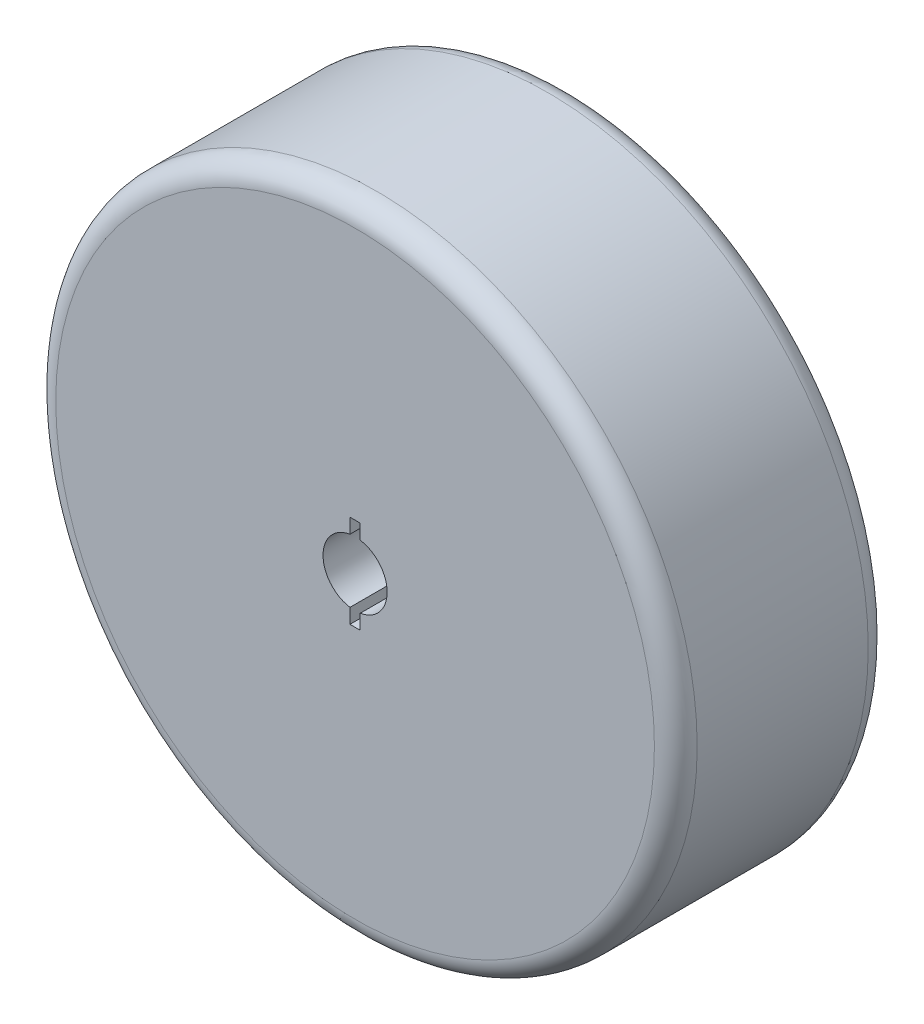
ISO-10303-21;
HEADER;
FILE_DESCRIPTION(('STEP AP214'),'2;1');
FILE_NAME('part.step','',(''),(''),'','','');
FILE_SCHEMA(('AUTOMOTIVE_DESIGN { 1 0 10303 214 1 1 1 1 }'));
ENDSEC;
DATA;
#1=APPLICATION_CONTEXT('core data for automotive mechanical design processes');
#2=APPLICATION_PROTOCOL_DEFINITION('international standard','automotive_design',2000,#1);
#3=PRODUCT_CONTEXT('',#1,'mechanical');
#4=PRODUCT('Part','Part','',(#3));
#5=PRODUCT_RELATED_PRODUCT_CATEGORY('part','',(#4));
#6=PRODUCT_DEFINITION_FORMATION('','',#4);
#7=PRODUCT_DEFINITION_CONTEXT('part definition',#1,'design');
#8=PRODUCT_DEFINITION('design','',#6,#7);
#9=PRODUCT_DEFINITION_SHAPE('','',#8);
#10=(LENGTH_UNIT() NAMED_UNIT(*) SI_UNIT(.MILLI.,.METRE.));
#11=(NAMED_UNIT(*) PLANE_ANGLE_UNIT() SI_UNIT($,.RADIAN.));
#12=(NAMED_UNIT(*) SI_UNIT($,.STERADIAN.) SOLID_ANGLE_UNIT());
#13=UNCERTAINTY_MEASURE_WITH_UNIT(LENGTH_MEASURE(1.E-05),#10,'distance_accuracy_value','');
#14=(GEOMETRIC_REPRESENTATION_CONTEXT(3) GLOBAL_UNCERTAINTY_ASSIGNED_CONTEXT((#13)) GLOBAL_UNIT_ASSIGNED_CONTEXT((#10,
#11,#12)) REPRESENTATION_CONTEXT('',''));
#15=CARTESIAN_POINT('',(0.,0.,0.));
#16=DIRECTION('',(0.,0.,1.));
#17=DIRECTION('',(1.,0.,0.));
#18=AXIS2_PLACEMENT_3D('',#15,#16,#17);
#19=CARTESIAN_POINT('',(0.,0.,-0.001000000000001));
#20=DIRECTION('',(0.,0.,1.));
#21=DIRECTION('',(1.,0.,0.));
#22=AXIS2_PLACEMENT_3D('',#19,#20,#21);
#23=CYLINDRICAL_SURFACE('',#22,3.81);
#24=CARTESIAN_POINT('',(0.,0.,25.4));
#25=DIRECTION('',(0.,0.,1.));
#26=DIRECTION('',(1.,0.,0.));
#27=AXIS2_PLACEMENT_3D('',#24,#25,#26);
#28=CIRCLE('',#27,3.81);
#29=CARTESIAN_POINT('',(0.610207571696719,-3.76081729407904,25.4));
#30=VERTEX_POINT('',#29);
#31=CARTESIAN_POINT('',(0.610207571696719,3.76081729407904,25.4));
#32=VERTEX_POINT('',#31);
#33=EDGE_CURVE('E117',#30,#32,#28,.T.);
#34=ORIENTED_EDGE('',*,*,#33,.T.);
#35=DIRECTION('',(0.,0.,1.));
#36=VECTOR('',#35,1.);
#37=CARTESIAN_POINT('',(0.610207571696719,3.76081729407904,-0.001000000000001));
#38=LINE('',#37,#36);
#39=CARTESIAN_POINT('',(0.610207571696719,3.76081729407904,0.));
#40=VERTEX_POINT('',#39);
#41=EDGE_CURVE('E99',#40,#32,#38,.T.);
#42=ORIENTED_EDGE('',*,*,#41,.F.);
#43=CARTESIAN_POINT('',(0.,0.,0.));
#44=DIRECTION('',(0.,0.,1.));
#45=DIRECTION('',(1.,0.,0.));
#46=AXIS2_PLACEMENT_3D('',#43,#44,#45);
#47=CIRCLE('',#46,3.81);
#48=CARTESIAN_POINT('',(0.610207571696719,-3.76081729407904,0.));
#49=VERTEX_POINT('',#48);
#50=EDGE_CURVE('E121',#40,#49,#47,.F.);
#51=ORIENTED_EDGE('',*,*,#50,.T.);
#52=DIRECTION('',(0.,0.,1.));
#53=VECTOR('',#52,1.);
#54=CARTESIAN_POINT('',(0.610207571696719,-3.76081729407904,-0.001000000000001));
#55=LINE('',#54,#53);
#56=EDGE_CURVE('E120',#30,#49,#55,.F.);
#57=ORIENTED_EDGE('',*,*,#56,.F.);
#58=EDGE_LOOP('',(#34,#42,#51,#57));
#59=FACE_BOUND('',#58,.T.);
#60=ADVANCED_FACE('F33',(#59),#23,.F.);
#61=CARTESIAN_POINT('',(0.,0.,25.4));
#62=DIRECTION('',(0.,0.,-1.));
#63=DIRECTION('',(-1.,0.,0.));
#64=AXIS2_PLACEMENT_3D('',#61,#62,#63);
#65=CYLINDRICAL_SURFACE('',#64,38.1);
#66=CARTESIAN_POINT('',(0.,0.,2.54));
#67=DIRECTION('',(0.,0.,1.));
#68=DIRECTION('',(1.,0.,0.));
#69=AXIS2_PLACEMENT_3D('',#66,#67,#68);
#70=CIRCLE('',#69,38.1);
#71=CARTESIAN_POINT('',(38.1,0.,2.54));
#72=VERTEX_POINT('',#71);
#73=EDGE_CURVE('E41',#72,#72,#70,.T.);
#74=ORIENTED_EDGE('',*,*,#73,.T.);
#75=EDGE_LOOP('',(#74));
#76=FACE_BOUND('',#75,.T.);
#77=CARTESIAN_POINT('',(0.,0.,22.86));
#78=DIRECTION('',(0.,0.,1.));
#79=DIRECTION('',(1.,0.,0.));
#80=AXIS2_PLACEMENT_3D('',#77,#78,#79);
#81=CIRCLE('',#80,38.1);
#82=CARTESIAN_POINT('',(38.1,0.,22.86));
#83=VERTEX_POINT('',#82);
#84=EDGE_CURVE('E135',#83,#83,#81,.F.);
#85=ORIENTED_EDGE('',*,*,#84,.T.);
#86=EDGE_LOOP('',(#85));
#87=FACE_BOUND('',#86,.T.);
#88=ADVANCED_FACE('F140',(#76,#87),#65,.T.);
#89=CARTESIAN_POINT('',(0.,0.,25.4));
#90=DIRECTION('',(0.,0.,1.));
#91=DIRECTION('',(1.,0.,0.));
#92=AXIS2_PLACEMENT_3D('',#89,#90,#91);
#93=PLANE('',#92);
#94=DIRECTION('',(0.,1.,0.));
#95=VECTOR('',#94,1.);
#96=CARTESIAN_POINT('',(0.610207571696719,-5.51132643214203,25.4));
#97=LINE('',#96,#95);
#98=CARTESIAN_POINT('',(0.610207571696719,5.51132643214203,25.4));
#99=VERTEX_POINT('',#98);
#100=EDGE_CURVE('E103',#32,#99,#97,.T.);
#101=ORIENTED_EDGE('',*,*,#100,.F.);
#102=ORIENTED_EDGE('',*,*,#33,.F.);
#103=DIRECTION('',(0.,1.,0.));
#104=VECTOR('',#103,1.);
#105=CARTESIAN_POINT('',(0.610207571696719,-5.51132643214203,25.4));
#106=LINE('',#105,#104);
#107=CARTESIAN_POINT('',(0.610207571696719,-5.51132643214203,25.4));
#108=VERTEX_POINT('',#107);
#109=EDGE_CURVE('E56',#108,#30,#106,.T.);
#110=ORIENTED_EDGE('',*,*,#109,.F.);
#111=DIRECTION('',(1.,0.,0.));
#112=VECTOR('',#111,1.);
#113=CARTESIAN_POINT('',(-0.610207571696719,-5.51132643214203,25.4));
#114=LINE('',#113,#112);
#115=CARTESIAN_POINT('',(-0.610207571696719,-5.51132643214203,25.4));
#116=VERTEX_POINT('',#115);
#117=EDGE_CURVE('E201',#116,#108,#114,.T.);
#118=ORIENTED_EDGE('',*,*,#117,.F.);
#119=DIRECTION('',(0.,-1.,0.));
#120=VECTOR('',#119,1.);
#121=CARTESIAN_POINT('',(-0.610207571696719,-5.51132643214203,25.4));
#122=LINE('',#121,#120);
#123=CARTESIAN_POINT('',(-0.610207571696719,-3.76081729407904,25.4));
#124=VERTEX_POINT('',#123);
#125=EDGE_CURVE('E198',#124,#116,#122,.T.);
#126=ORIENTED_EDGE('',*,*,#125,.F.);
#127=CARTESIAN_POINT('',(-0.610207571696719,3.76081729407904,25.4));
#128=VERTEX_POINT('',#127);
#129=EDGE_CURVE('E122',#128,#124,#28,.T.);
#130=ORIENTED_EDGE('',*,*,#129,.F.);
#131=DIRECTION('',(0.,-1.,0.));
#132=VECTOR('',#131,1.);
#133=CARTESIAN_POINT('',(-0.610207571696719,-5.51132643214203,25.4));
#134=LINE('',#133,#132);
#135=CARTESIAN_POINT('',(-0.610207571696719,5.51132643214203,25.4));
#136=VERTEX_POINT('',#135);
#137=EDGE_CURVE('E48',#136,#128,#134,.T.);
#138=ORIENTED_EDGE('',*,*,#137,.F.);
#139=DIRECTION('',(-1.,0.,0.));
#140=VECTOR('',#139,1.);
#141=CARTESIAN_POINT('',(-0.610207571696719,5.51132643214203,25.4));
#142=LINE('',#141,#140);
#143=EDGE_CURVE('E111',#99,#136,#142,.T.);
#144=ORIENTED_EDGE('',*,*,#143,.F.);
#145=EDGE_LOOP('',(#101,#102,#110,#118,#126,#130,#138,#144));
#146=FACE_BOUND('',#145,.T.);
#147=CARTESIAN_POINT('',(0.,0.,25.4));
#148=DIRECTION('',(0.,0.,1.));
#149=DIRECTION('',(1.,0.,0.));
#150=AXIS2_PLACEMENT_3D('',#147,#148,#149);
#151=CIRCLE('',#150,35.56);
#152=CARTESIAN_POINT('',(35.56,0.,25.4));
#153=VERTEX_POINT('',#152);
#154=EDGE_CURVE('E132',#153,#153,#151,.T.);
#155=ORIENTED_EDGE('',*,*,#154,.T.);
#156=EDGE_LOOP('',(#155));
#157=FACE_BOUND('',#156,.T.);
#158=ADVANCED_FACE('F115',(#146,#157),#93,.T.);
#159=CARTESIAN_POINT('',(0.,0.,0.));
#160=DIRECTION('',(0.,0.,1.));
#161=DIRECTION('',(1.,0.,0.));
#162=AXIS2_PLACEMENT_3D('',#159,#160,#161);
#163=PLANE('',#162);
#164=ORIENTED_EDGE('',*,*,#50,.F.);
#165=DIRECTION('',(0.,-1.,0.));
#166=VECTOR('',#165,1.);
#167=CARTESIAN_POINT('',(0.610207571696719,-5.51132643214203,0.));
#168=LINE('',#167,#166);
#169=CARTESIAN_POINT('',(0.610207571696719,5.51132643214203,0.));
#170=VERTEX_POINT('',#169);
#171=EDGE_CURVE('E106',#170,#40,#168,.T.);
#172=ORIENTED_EDGE('',*,*,#171,.F.);
#173=DIRECTION('',(1.,0.,0.));
#174=VECTOR('',#173,1.);
#175=CARTESIAN_POINT('',(-0.610207571696719,5.51132643214203,0.));
#176=LINE('',#175,#174);
#177=CARTESIAN_POINT('',(-0.610207571696719,5.51132643214203,0.));
#178=VERTEX_POINT('',#177);
#179=EDGE_CURVE('E185',#178,#170,#176,.T.);
#180=ORIENTED_EDGE('',*,*,#179,.F.);
#181=DIRECTION('',(0.,1.,0.));
#182=VECTOR('',#181,1.);
#183=CARTESIAN_POINT('',(-0.610207571696719,-5.51132643214203,0.));
#184=LINE('',#183,#182);
#185=CARTESIAN_POINT('',(-0.610207571696719,3.76081729407904,0.));
#186=VERTEX_POINT('',#185);
#187=EDGE_CURVE('E184',#186,#178,#184,.T.);
#188=ORIENTED_EDGE('',*,*,#187,.F.);
#189=CARTESIAN_POINT('',(-0.610207571696719,-3.76081729407904,0.));
#190=VERTEX_POINT('',#189);
#191=EDGE_CURVE('E124',#190,#186,#47,.F.);
#192=ORIENTED_EDGE('',*,*,#191,.F.);
#193=DIRECTION('',(0.,1.,0.));
#194=VECTOR('',#193,1.);
#195=CARTESIAN_POINT('',(-0.610207571696719,-5.51132643214203,0.));
#196=LINE('',#195,#194);
#197=CARTESIAN_POINT('',(-0.610207571696719,-5.51132643214203,0.));
#198=VERTEX_POINT('',#197);
#199=EDGE_CURVE('E182',#198,#190,#196,.T.);
#200=ORIENTED_EDGE('',*,*,#199,.F.);
#201=DIRECTION('',(-1.,0.,0.));
#202=VECTOR('',#201,1.);
#203=CARTESIAN_POINT('',(-0.610207571696719,-5.51132643214203,0.));
#204=LINE('',#203,#202);
#205=CARTESIAN_POINT('',(0.610207571696719,-5.51132643214203,0.));
#206=VERTEX_POINT('',#205);
#207=EDGE_CURVE('E193',#206,#198,#204,.T.);
#208=ORIENTED_EDGE('',*,*,#207,.F.);
#209=DIRECTION('',(0.,-1.,0.));
#210=VECTOR('',#209,1.);
#211=CARTESIAN_POINT('',(0.610207571696719,-5.51132643214203,0.));
#212=LINE('',#211,#210);
#213=EDGE_CURVE('E194',#49,#206,#212,.T.);
#214=ORIENTED_EDGE('',*,*,#213,.F.);
#215=EDGE_LOOP('',(#164,#172,#180,#188,#192,#200,#208,#214));
#216=FACE_BOUND('',#215,.T.);
#217=CARTESIAN_POINT('',(0.,0.,0.));
#218=DIRECTION('',(0.,0.,1.));
#219=DIRECTION('',(1.,0.,0.));
#220=AXIS2_PLACEMENT_3D('',#217,#218,#219);
#221=CIRCLE('',#220,35.56);
#222=CARTESIAN_POINT('',(35.56,0.,0.));
#223=VERTEX_POINT('',#222);
#224=EDGE_CURVE('E11',#223,#223,#221,.F.);
#225=ORIENTED_EDGE('',*,*,#224,.T.);
#226=EDGE_LOOP('',(#225));
#227=FACE_BOUND('',#226,.T.);
#228=ADVANCED_FACE('F166',(#216,#227),#163,.F.);
#229=ORIENTED_EDGE('',*,*,#191,.T.);
#230=DIRECTION('',(0.,0.,1.));
#231=VECTOR('',#230,1.);
#232=CARTESIAN_POINT('',(-0.610207571696719,3.76081729407904,-0.001000000000001));
#233=LINE('',#232,#231);
#234=EDGE_CURVE('E110',#128,#186,#233,.F.);
#235=ORIENTED_EDGE('',*,*,#234,.F.);
#236=ORIENTED_EDGE('',*,*,#129,.T.);
#237=DIRECTION('',(0.,0.,1.));
#238=VECTOR('',#237,1.);
#239=CARTESIAN_POINT('',(-0.610207571696719,-3.76081729407904,-0.001000000000001));
#240=LINE('',#239,#238);
#241=EDGE_CURVE('E177',#190,#124,#240,.T.);
#242=ORIENTED_EDGE('',*,*,#241,.F.);
#243=EDGE_LOOP('',(#229,#235,#236,#242));
#244=FACE_BOUND('',#243,.T.);
#245=ADVANCED_FACE('F154',(#244),#23,.F.);
#246=CARTESIAN_POINT('',(0.,0.,22.86));
#247=DIRECTION('',(0.,0.,1.));
#248=DIRECTION('',(1.,0.,0.));
#249=AXIS2_PLACEMENT_3D('',#246,#247,#248);
#250=TOROIDAL_SURFACE('',#249,35.56,2.54);
#251=ORIENTED_EDGE('',*,*,#84,.F.);
#252=EDGE_LOOP('',(#251));
#253=FACE_BOUND('',#252,.T.);
#254=ORIENTED_EDGE('',*,*,#154,.F.);
#255=EDGE_LOOP('',(#254));
#256=FACE_BOUND('',#255,.T.);
#257=ADVANCED_FACE('F145',(#253,#256),#250,.T.);
#258=CARTESIAN_POINT('',(0.,0.,2.54));
#259=DIRECTION('',(0.,0.,1.));
#260=DIRECTION('',(1.,0.,0.));
#261=AXIS2_PLACEMENT_3D('',#258,#259,#260);
#262=TOROIDAL_SURFACE('',#261,35.56,2.54);
#263=ORIENTED_EDGE('',*,*,#224,.F.);
#264=EDGE_LOOP('',(#263));
#265=FACE_BOUND('',#264,.T.);
#266=ORIENTED_EDGE('',*,*,#73,.F.);
#267=EDGE_LOOP('',(#266));
#268=FACE_BOUND('',#267,.T.);
#269=ADVANCED_FACE('F35',(#265,#268),#262,.T.);
#270=CARTESIAN_POINT('',(-0.610207571696719,-5.51132643214203,-0.001000000000001));
#271=DIRECTION('',(-1.,0.,0.));
#272=DIRECTION('',(0.,0.,1.));
#273=AXIS2_PLACEMENT_3D('',#270,#271,#272);
#274=PLANE('',#273);
#275=ORIENTED_EDGE('',*,*,#199,.T.);
#276=ORIENTED_EDGE('',*,*,#241,.T.);
#277=ORIENTED_EDGE('',*,*,#125,.T.);
#278=DIRECTION('',(0.,0.,1.));
#279=VECTOR('',#278,1.);
#280=CARTESIAN_POINT('',(-0.610207571696719,-5.51132643214203,-0.001000000000001));
#281=LINE('',#280,#279);
#282=EDGE_CURVE('E128',#198,#116,#281,.T.);
#283=ORIENTED_EDGE('',*,*,#282,.F.);
#284=EDGE_LOOP('',(#275,#276,#277,#283));
#285=FACE_BOUND('',#284,.T.);
#286=ADVANCED_FACE('F144',(#285),#274,.F.);
#287=CARTESIAN_POINT('',(-0.610207571696719,-5.51132643214203,-0.001000000000001));
#288=DIRECTION('',(0.,-1.,0.));
#289=DIRECTION('',(0.,0.,-1.));
#290=AXIS2_PLACEMENT_3D('',#287,#288,#289);
#291=PLANE('',#290);
#292=ORIENTED_EDGE('',*,*,#207,.T.);
#293=ORIENTED_EDGE('',*,*,#282,.T.);
#294=ORIENTED_EDGE('',*,*,#117,.T.);
#295=DIRECTION('',(0.,0.,1.));
#296=VECTOR('',#295,1.);
#297=CARTESIAN_POINT('',(0.610207571696719,-5.51132643214203,-0.001000000000001));
#298=LINE('',#297,#296);
#299=EDGE_CURVE('E126',#206,#108,#298,.T.);
#300=ORIENTED_EDGE('',*,*,#299,.F.);
#301=EDGE_LOOP('',(#292,#293,#294,#300));
#302=FACE_BOUND('',#301,.T.);
#303=ADVANCED_FACE('F151',(#302),#291,.F.);
#304=CARTESIAN_POINT('',(0.610207571696719,-5.51132643214203,-0.001000000000001));
#305=DIRECTION('',(1.,0.,0.));
#306=DIRECTION('',(0.,0.,-1.));
#307=AXIS2_PLACEMENT_3D('',#304,#305,#306);
#308=PLANE('',#307);
#309=ORIENTED_EDGE('',*,*,#213,.T.);
#310=ORIENTED_EDGE('',*,*,#299,.T.);
#311=ORIENTED_EDGE('',*,*,#109,.T.);
#312=ORIENTED_EDGE('',*,*,#56,.T.);
#313=EDGE_LOOP('',(#309,#310,#311,#312));
#314=FACE_BOUND('',#313,.T.);
#315=ADVANCED_FACE('F219',(#314),#308,.F.);
#316=CARTESIAN_POINT('',(0.610207571696719,-5.51132643214203,-0.001000000000001));
#317=DIRECTION('',(1.,0.,0.));
#318=DIRECTION('',(0.,0.,-1.));
#319=AXIS2_PLACEMENT_3D('',#316,#317,#318);
#320=PLANE('',#319);
#321=ORIENTED_EDGE('',*,*,#171,.T.);
#322=ORIENTED_EDGE('',*,*,#41,.T.);
#323=ORIENTED_EDGE('',*,*,#100,.T.);
#324=DIRECTION('',(0.,0.,1.));
#325=VECTOR('',#324,1.);
#326=CARTESIAN_POINT('',(0.610207571696719,5.51132643214203,-0.001000000000001));
#327=LINE('',#326,#325);
#328=EDGE_CURVE('E210',#170,#99,#327,.T.);
#329=ORIENTED_EDGE('',*,*,#328,.F.);
#330=EDGE_LOOP('',(#321,#322,#323,#329));
#331=FACE_BOUND('',#330,.T.);
#332=ADVANCED_FACE('F101',(#331),#320,.F.);
#333=CARTESIAN_POINT('',(-0.610207571696719,-5.51132643214203,-0.001000000000001));
#334=DIRECTION('',(-1.,0.,0.));
#335=DIRECTION('',(0.,0.,1.));
#336=AXIS2_PLACEMENT_3D('',#333,#334,#335);
#337=PLANE('',#336);
#338=ORIENTED_EDGE('',*,*,#187,.T.);
#339=DIRECTION('',(0.,0.,1.));
#340=VECTOR('',#339,1.);
#341=CARTESIAN_POINT('',(-0.610207571696719,5.51132643214203,-0.001000000000001));
#342=LINE('',#341,#340);
#343=EDGE_CURVE('E208',#178,#136,#342,.T.);
#344=ORIENTED_EDGE('',*,*,#343,.T.);
#345=ORIENTED_EDGE('',*,*,#137,.T.);
#346=ORIENTED_EDGE('',*,*,#234,.T.);
#347=EDGE_LOOP('',(#338,#344,#345,#346));
#348=FACE_BOUND('',#347,.T.);
#349=ADVANCED_FACE('F225',(#348),#337,.F.);
#350=CARTESIAN_POINT('',(-0.610207571696719,5.51132643214203,-0.001000000000001));
#351=DIRECTION('',(0.,1.,0.));
#352=DIRECTION('',(0.,0.,1.));
#353=AXIS2_PLACEMENT_3D('',#350,#351,#352);
#354=PLANE('',#353);
#355=ORIENTED_EDGE('',*,*,#179,.T.);
#356=ORIENTED_EDGE('',*,*,#328,.T.);
#357=ORIENTED_EDGE('',*,*,#143,.T.);
#358=ORIENTED_EDGE('',*,*,#343,.F.);
#359=EDGE_LOOP('',(#355,#356,#357,#358));
#360=FACE_BOUND('',#359,.T.);
#361=ADVANCED_FACE('F217',(#360),#354,.F.);
#362=CLOSED_SHELL('',(#60,#88,#158,#228,#245,#257,#269,#286,#303,#315,#332,#349,#361));
#363=MANIFOLD_SOLID_BREP('B2',#362);
#364=ADVANCED_BREP_SHAPE_REPRESENTATION('',(#18,#363),#14);
#365=SHAPE_DEFINITION_REPRESENTATION(#9,#364);
ENDSEC;
END-ISO-10303-21;
